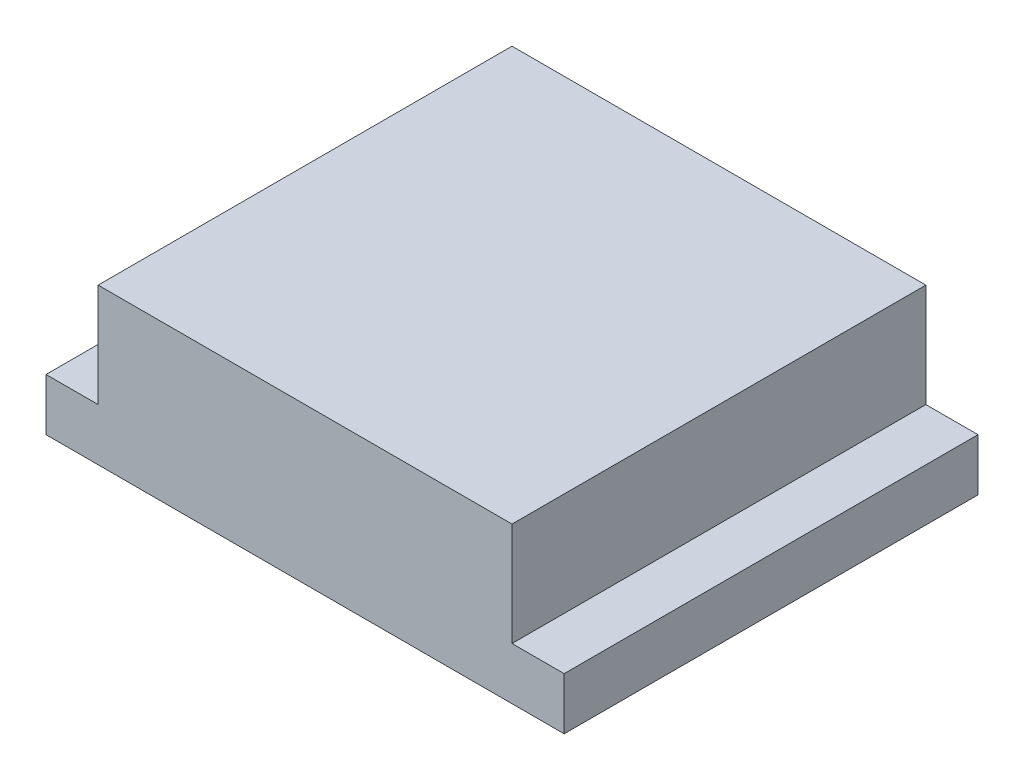
ISO-10303-21;
HEADER;
FILE_DESCRIPTION(('STEP AP214'),'2;1');
FILE_NAME('part.step','',(''),(''),'','','');
FILE_SCHEMA(('AUTOMOTIVE_DESIGN { 1 0 10303 214 1 1 1 1 }'));
ENDSEC;
DATA;
#1=APPLICATION_CONTEXT('core data for automotive mechanical design processes');
#2=APPLICATION_PROTOCOL_DEFINITION('international standard','automotive_design',2000,#1);
#3=PRODUCT_CONTEXT('',#1,'mechanical');
#4=PRODUCT('Part','Part','',(#3));
#5=PRODUCT_RELATED_PRODUCT_CATEGORY('part','',(#4));
#6=PRODUCT_DEFINITION_FORMATION('','',#4);
#7=PRODUCT_DEFINITION_CONTEXT('part definition',#1,'design');
#8=PRODUCT_DEFINITION('design','',#6,#7);
#9=PRODUCT_DEFINITION_SHAPE('','',#8);
#10=(LENGTH_UNIT() NAMED_UNIT(*) SI_UNIT(.MILLI.,.METRE.));
#11=(NAMED_UNIT(*) PLANE_ANGLE_UNIT() SI_UNIT($,.RADIAN.));
#12=(NAMED_UNIT(*) SI_UNIT($,.STERADIAN.) SOLID_ANGLE_UNIT());
#13=UNCERTAINTY_MEASURE_WITH_UNIT(LENGTH_MEASURE(1.E-05),#10,'distance_accuracy_value','');
#14=(GEOMETRIC_REPRESENTATION_CONTEXT(3) GLOBAL_UNCERTAINTY_ASSIGNED_CONTEXT((#13)) GLOBAL_UNIT_ASSIGNED_CONTEXT((#10,
#11,#12)) REPRESENTATION_CONTEXT('',''));
#15=CARTESIAN_POINT('',(0.,0.,0.));
#16=DIRECTION('',(0.,0.,1.));
#17=DIRECTION('',(1.,0.,0.));
#18=AXIS2_PLACEMENT_3D('',#15,#16,#17);
#19=CARTESIAN_POINT('',(3.175,3.1877,-6.35));
#20=DIRECTION('',(0.,1.,0.));
#21=DIRECTION('',(1.,0.,0.));
#22=AXIS2_PLACEMENT_3D('',#19,#20,#21);
#23=PLANE('',#22);
#24=DIRECTION('',(-1.,0.,0.));
#25=VECTOR('',#24,1.);
#26=CARTESIAN_POINT('',(3.175,3.1877,0.));
#27=LINE('',#26,#25);
#28=CARTESIAN_POINT('',(3.9751,3.1877,0.));
#29=VERTEX_POINT('',#28);
#30=CARTESIAN_POINT('',(3.175,3.1877,0.));
#31=VERTEX_POINT('',#30);
#32=EDGE_CURVE('E145',#29,#31,#27,.T.);
#33=ORIENTED_EDGE('',*,*,#32,.F.);
#34=DIRECTION('',(0.,0.,1.));
#35=VECTOR('',#34,1.);
#36=CARTESIAN_POINT('',(3.9751,3.1877,-6.35));
#37=LINE('',#36,#35);
#38=CARTESIAN_POINT('',(3.9751,3.1877,-6.35));
#39=VERTEX_POINT('',#38);
#40=EDGE_CURVE('E130',#39,#29,#37,.T.);
#41=ORIENTED_EDGE('',*,*,#40,.F.);
#42=DIRECTION('',(-1.,0.,0.));
#43=VECTOR('',#42,1.);
#44=CARTESIAN_POINT('',(3.175,3.1877,-6.35));
#45=LINE('',#44,#43);
#46=CARTESIAN_POINT('',(3.175,3.1877,-6.35));
#47=VERTEX_POINT('',#46);
#48=EDGE_CURVE('E11',#39,#47,#45,.T.);
#49=ORIENTED_EDGE('',*,*,#48,.T.);
#50=DIRECTION('',(0.,0.,1.));
#51=VECTOR('',#50,1.);
#52=CARTESIAN_POINT('',(3.175,3.1877,-6.35));
#53=LINE('',#52,#51);
#54=EDGE_CURVE('E46',#47,#31,#53,.T.);
#55=ORIENTED_EDGE('',*,*,#54,.T.);
#56=EDGE_LOOP('',(#33,#41,#49,#55));
#57=FACE_BOUND('',#56,.T.);
#58=ADVANCED_FACE('F36',(#57),#23,.T.);
#59=CARTESIAN_POINT('',(3.9751,1.5875,-6.35));
#60=DIRECTION('',(1.,0.,0.));
#61=DIRECTION('',(0.,1.,0.));
#62=AXIS2_PLACEMENT_3D('',#59,#60,#61);
#63=PLANE('',#62);
#64=DIRECTION('',(0.,0.,-1.));
#65=VECTOR('',#64,1.);
#66=CARTESIAN_POINT('',(3.9751,2.3876,-6.35));
#67=LINE('',#66,#65);
#68=CARTESIAN_POINT('',(3.9751,2.3876,0.));
#69=VERTEX_POINT('',#68);
#70=CARTESIAN_POINT('',(3.9751,2.3876,-6.35));
#71=VERTEX_POINT('',#70);
#72=EDGE_CURVE('E54',#69,#71,#67,.T.);
#73=ORIENTED_EDGE('',*,*,#72,.T.);
#74=DIRECTION('',(0.,1.,0.));
#75=VECTOR('',#74,1.);
#76=CARTESIAN_POINT('',(3.9751,1.5875,-6.35));
#77=LINE('',#76,#75);
#78=EDGE_CURVE('E40',#71,#39,#77,.T.);
#79=ORIENTED_EDGE('',*,*,#78,.T.);
#80=ORIENTED_EDGE('',*,*,#40,.T.);
#81=DIRECTION('',(0.,1.,0.));
#82=VECTOR('',#81,1.);
#83=CARTESIAN_POINT('',(3.9751,1.5875,0.));
#84=LINE('',#83,#82);
#85=EDGE_CURVE('E66',#69,#29,#84,.T.);
#86=ORIENTED_EDGE('',*,*,#85,.F.);
#87=EDGE_LOOP('',(#73,#79,#80,#86));
#88=FACE_BOUND('',#87,.T.);
#89=ADVANCED_FACE('F222',(#88),#63,.T.);
#90=CARTESIAN_POINT('',(-3.9751,1.5875,-6.35));
#91=DIRECTION('',(-1.,0.,0.));
#92=DIRECTION('',(0.,0.,1.));
#93=AXIS2_PLACEMENT_3D('',#90,#91,#92);
#94=PLANE('',#93);
#95=DIRECTION('',(0.,0.,1.));
#96=VECTOR('',#95,1.);
#97=CARTESIAN_POINT('',(-3.9751,2.3876,-6.35));
#98=LINE('',#97,#96);
#99=CARTESIAN_POINT('',(-3.9751,2.3876,-6.35));
#100=VERTEX_POINT('',#99);
#101=CARTESIAN_POINT('',(-3.9751,2.3876,0.));
#102=VERTEX_POINT('',#101);
#103=EDGE_CURVE('E199',#100,#102,#98,.T.);
#104=ORIENTED_EDGE('',*,*,#103,.T.);
#105=DIRECTION('',(0.,-1.,0.));
#106=VECTOR('',#105,1.);
#107=CARTESIAN_POINT('',(-3.9751,1.5875,0.));
#108=LINE('',#107,#106);
#109=CARTESIAN_POINT('',(-3.9751,3.1877,0.));
#110=VERTEX_POINT('',#109);
#111=EDGE_CURVE('E148',#110,#102,#108,.T.);
#112=ORIENTED_EDGE('',*,*,#111,.F.);
#113=DIRECTION('',(0.,0.,1.));
#114=VECTOR('',#113,1.);
#115=CARTESIAN_POINT('',(-3.9751,3.1877,-6.35));
#116=LINE('',#115,#114);
#117=CARTESIAN_POINT('',(-3.9751,3.1877,-6.35));
#118=VERTEX_POINT('',#117);
#119=EDGE_CURVE('E156',#118,#110,#116,.T.);
#120=ORIENTED_EDGE('',*,*,#119,.F.);
#121=DIRECTION('',(0.,-1.,0.));
#122=VECTOR('',#121,1.);
#123=CARTESIAN_POINT('',(-3.9751,1.5875,-6.35));
#124=LINE('',#123,#122);
#125=EDGE_CURVE('E151',#118,#100,#124,.T.);
#126=ORIENTED_EDGE('',*,*,#125,.T.);
#127=EDGE_LOOP('',(#104,#112,#120,#126));
#128=FACE_BOUND('',#127,.T.);
#129=ADVANCED_FACE('F196',(#128),#94,.T.);
#130=CARTESIAN_POINT('',(-3.175,3.1877,-6.35));
#131=DIRECTION('',(0.,1.,0.));
#132=DIRECTION('',(1.,0.,0.));
#133=AXIS2_PLACEMENT_3D('',#130,#131,#132);
#134=PLANE('',#133);
#135=DIRECTION('',(-1.,0.,0.));
#136=VECTOR('',#135,1.);
#137=CARTESIAN_POINT('',(-3.175,3.1877,0.));
#138=LINE('',#137,#136);
#139=CARTESIAN_POINT('',(-3.175,3.1877,0.));
#140=VERTEX_POINT('',#139);
#141=EDGE_CURVE('E166',#140,#110,#138,.T.);
#142=ORIENTED_EDGE('',*,*,#141,.F.);
#143=DIRECTION('',(0.,0.,1.));
#144=VECTOR('',#143,1.);
#145=CARTESIAN_POINT('',(-3.175,3.1877,-6.35));
#146=LINE('',#145,#144);
#147=CARTESIAN_POINT('',(-3.175,3.1877,-6.35));
#148=VERTEX_POINT('',#147);
#149=EDGE_CURVE('E165',#148,#140,#146,.T.);
#150=ORIENTED_EDGE('',*,*,#149,.F.);
#151=DIRECTION('',(-1.,0.,0.));
#152=VECTOR('',#151,1.);
#153=CARTESIAN_POINT('',(-3.175,3.1877,-6.35));
#154=LINE('',#153,#152);
#155=EDGE_CURVE('E160',#148,#118,#154,.T.);
#156=ORIENTED_EDGE('',*,*,#155,.T.);
#157=ORIENTED_EDGE('',*,*,#119,.T.);
#158=EDGE_LOOP('',(#142,#150,#156,#157));
#159=FACE_BOUND('',#158,.T.);
#160=ADVANCED_FACE('F210',(#159),#134,.T.);
#161=CARTESIAN_POINT('',(-3.175,4.7752,-6.35));
#162=DIRECTION('',(-1.,0.,0.));
#163=DIRECTION('',(0.,0.,1.));
#164=AXIS2_PLACEMENT_3D('',#161,#162,#163);
#165=PLANE('',#164);
#166=DIRECTION('',(0.,-1.,0.));
#167=VECTOR('',#166,1.);
#168=CARTESIAN_POINT('',(-3.175,4.7752,0.));
#169=LINE('',#168,#167);
#170=CARTESIAN_POINT('',(-3.175,4.7752,0.));
#171=VERTEX_POINT('',#170);
#172=EDGE_CURVE('E170',#171,#140,#169,.T.);
#173=ORIENTED_EDGE('',*,*,#172,.F.);
#174=DIRECTION('',(0.,0.,1.));
#175=VECTOR('',#174,1.);
#176=CARTESIAN_POINT('',(-3.175,4.7752,-6.35));
#177=LINE('',#176,#175);
#178=CARTESIAN_POINT('',(-3.175,4.7752,-6.35));
#179=VERTEX_POINT('',#178);
#180=EDGE_CURVE('E137',#179,#171,#177,.T.);
#181=ORIENTED_EDGE('',*,*,#180,.F.);
#182=DIRECTION('',(0.,-1.,0.));
#183=VECTOR('',#182,1.);
#184=CARTESIAN_POINT('',(-3.175,4.7752,-6.35));
#185=LINE('',#184,#183);
#186=EDGE_CURVE('E161',#179,#148,#185,.T.);
#187=ORIENTED_EDGE('',*,*,#186,.T.);
#188=ORIENTED_EDGE('',*,*,#149,.T.);
#189=EDGE_LOOP('',(#173,#181,#187,#188));
#190=FACE_BOUND('',#189,.T.);
#191=ADVANCED_FACE('F212',(#190),#165,.T.);
#192=CARTESIAN_POINT('',(-3.175,4.7752,-6.35));
#193=DIRECTION('',(0.,1.,0.));
#194=DIRECTION('',(1.,0.,0.));
#195=AXIS2_PLACEMENT_3D('',#192,#193,#194);
#196=PLANE('',#195);
#197=DIRECTION('',(-1.,0.,0.));
#198=VECTOR('',#197,1.);
#199=CARTESIAN_POINT('',(-3.175,4.7752,0.));
#200=LINE('',#199,#198);
#201=CARTESIAN_POINT('',(3.175,4.7752,0.));
#202=VERTEX_POINT('',#201);
#203=EDGE_CURVE('E93',#202,#171,#200,.T.);
#204=ORIENTED_EDGE('',*,*,#203,.F.);
#205=DIRECTION('',(0.,0.,1.));
#206=VECTOR('',#205,1.);
#207=CARTESIAN_POINT('',(3.175,4.7752,-6.35));
#208=LINE('',#207,#206);
#209=CARTESIAN_POINT('',(3.175,4.7752,-6.35));
#210=VERTEX_POINT('',#209);
#211=EDGE_CURVE('E104',#210,#202,#208,.T.);
#212=ORIENTED_EDGE('',*,*,#211,.F.);
#213=DIRECTION('',(-1.,0.,0.));
#214=VECTOR('',#213,1.);
#215=CARTESIAN_POINT('',(-3.175,4.7752,-6.35));
#216=LINE('',#215,#214);
#217=EDGE_CURVE('E135',#210,#179,#216,.T.);
#218=ORIENTED_EDGE('',*,*,#217,.T.);
#219=ORIENTED_EDGE('',*,*,#180,.T.);
#220=EDGE_LOOP('',(#204,#212,#218,#219));
#221=FACE_BOUND('',#220,.T.);
#222=ADVANCED_FACE('F213',(#221),#196,.T.);
#223=CARTESIAN_POINT('',(3.175,4.7752,-6.35));
#224=DIRECTION('',(1.,0.,0.));
#225=DIRECTION('',(0.,1.,0.));
#226=AXIS2_PLACEMENT_3D('',#223,#224,#225);
#227=PLANE('',#226);
#228=DIRECTION('',(0.,1.,0.));
#229=VECTOR('',#228,1.);
#230=CARTESIAN_POINT('',(3.175,4.7752,0.));
#231=LINE('',#230,#229);
#232=EDGE_CURVE('E123',#31,#202,#231,.T.);
#233=ORIENTED_EDGE('',*,*,#232,.F.);
#234=ORIENTED_EDGE('',*,*,#54,.F.);
#235=DIRECTION('',(0.,1.,0.));
#236=VECTOR('',#235,1.);
#237=CARTESIAN_POINT('',(3.175,4.7752,-6.35));
#238=LINE('',#237,#236);
#239=EDGE_CURVE('E121',#47,#210,#238,.T.);
#240=ORIENTED_EDGE('',*,*,#239,.T.);
#241=ORIENTED_EDGE('',*,*,#211,.T.);
#242=EDGE_LOOP('',(#233,#234,#240,#241));
#243=FACE_BOUND('',#242,.T.);
#244=ADVANCED_FACE('F38',(#243),#227,.T.);
#245=CARTESIAN_POINT('',(3.9751,3.1877,-6.35));
#246=DIRECTION('',(0.,0.,1.));
#247=DIRECTION('',(1.,0.,0.));
#248=AXIS2_PLACEMENT_3D('',#245,#246,#247);
#249=PLANE('',#248);
#250=ORIENTED_EDGE('',*,*,#78,.F.);
#251=DIRECTION('',(-1.,0.,0.));
#252=VECTOR('',#251,1.);
#253=CARTESIAN_POINT('',(-3.9751,2.3876,-6.35));
#254=LINE('',#253,#252);
#255=EDGE_CURVE('E153',#71,#100,#254,.T.);
#256=ORIENTED_EDGE('',*,*,#255,.T.);
#257=ORIENTED_EDGE('',*,*,#125,.F.);
#258=ORIENTED_EDGE('',*,*,#155,.F.);
#259=ORIENTED_EDGE('',*,*,#186,.F.);
#260=ORIENTED_EDGE('',*,*,#217,.F.);
#261=ORIENTED_EDGE('',*,*,#239,.F.);
#262=ORIENTED_EDGE('',*,*,#48,.F.);
#263=EDGE_LOOP('',(#250,#256,#257,#258,#259,#260,#261,#262));
#264=FACE_BOUND('',#263,.T.);
#265=ADVANCED_FACE('F133',(#264),#249,.F.);
#266=CARTESIAN_POINT('',(3.9751,3.1877,0.));
#267=DIRECTION('',(0.,0.,1.));
#268=DIRECTION('',(1.,0.,0.));
#269=AXIS2_PLACEMENT_3D('',#266,#267,#268);
#270=PLANE('',#269);
#271=DIRECTION('',(1.,0.,0.));
#272=VECTOR('',#271,1.);
#273=CARTESIAN_POINT('',(-3.9751,2.3876,0.));
#274=LINE('',#273,#272);
#275=EDGE_CURVE('E224',#102,#69,#274,.T.);
#276=ORIENTED_EDGE('',*,*,#275,.T.);
#277=ORIENTED_EDGE('',*,*,#85,.T.);
#278=ORIENTED_EDGE('',*,*,#32,.T.);
#279=ORIENTED_EDGE('',*,*,#232,.T.);
#280=ORIENTED_EDGE('',*,*,#203,.T.);
#281=ORIENTED_EDGE('',*,*,#172,.T.);
#282=ORIENTED_EDGE('',*,*,#141,.T.);
#283=ORIENTED_EDGE('',*,*,#111,.T.);
#284=EDGE_LOOP('',(#276,#277,#278,#279,#280,#281,#282,#283));
#285=FACE_BOUND('',#284,.T.);
#286=ADVANCED_FACE('F220',(#285),#270,.T.);
#287=CARTESIAN_POINT('',(0.,2.3876,0.));
#288=DIRECTION('',(0.,1.,0.));
#289=DIRECTION('',(-1.,0.,0.));
#290=AXIS2_PLACEMENT_3D('',#287,#288,#289);
#291=PLANE('',#290);
#292=ORIENTED_EDGE('',*,*,#103,.F.);
#293=ORIENTED_EDGE('',*,*,#255,.F.);
#294=ORIENTED_EDGE('',*,*,#72,.F.);
#295=ORIENTED_EDGE('',*,*,#275,.F.);
#296=EDGE_LOOP('',(#292,#293,#294,#295));
#297=FACE_BOUND('',#296,.T.);
#298=ADVANCED_FACE('F225',(#297),#291,.F.);
#299=CLOSED_SHELL('',(#58,#89,#129,#160,#191,#222,#244,#265,#286,#298));
#300=MANIFOLD_SOLID_BREP('B2',#299);
#301=ADVANCED_BREP_SHAPE_REPRESENTATION('',(#18,#300),#14);
#302=SHAPE_DEFINITION_REPRESENTATION(#9,#301);
ENDSEC;
END-ISO-10303-21;
